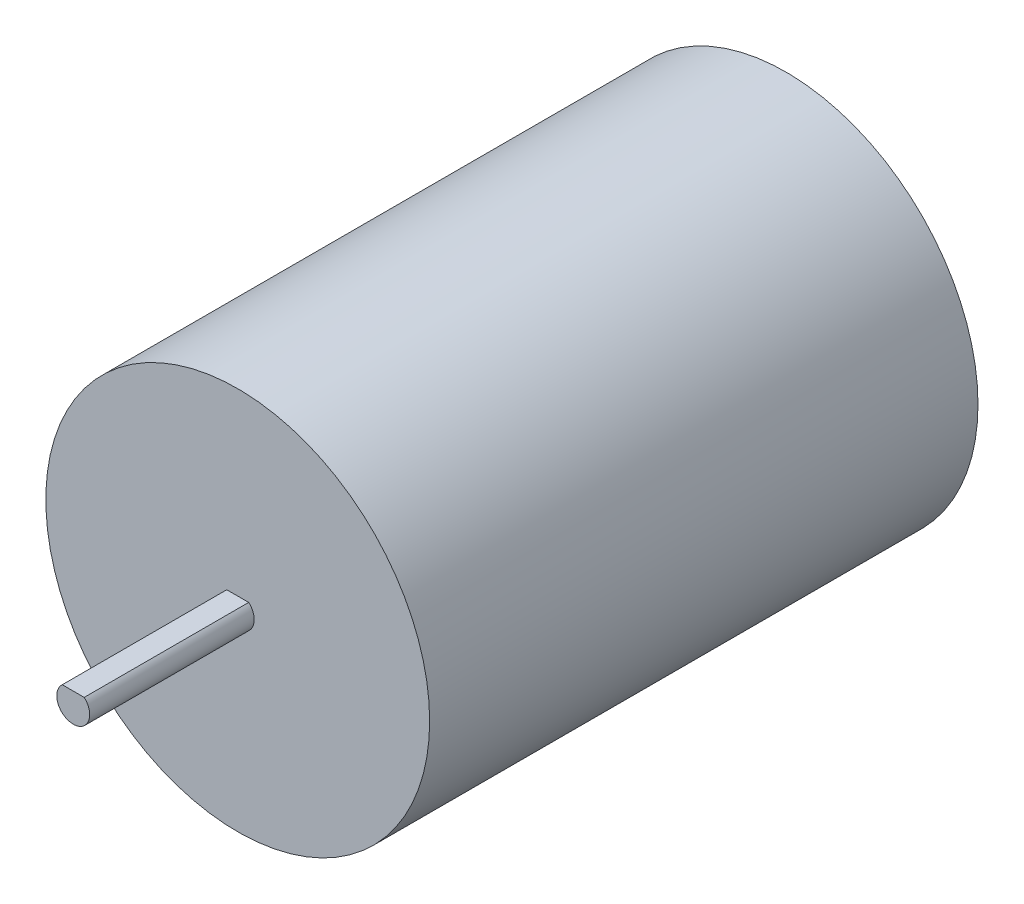
ISO-10303-21;
HEADER;
FILE_DESCRIPTION(('STEP AP214'),'2;1');
FILE_NAME('part.step','',(''),(''),'','','');
FILE_SCHEMA(('AUTOMOTIVE_DESIGN { 1 0 10303 214 1 1 1 1 }'));
ENDSEC;
DATA;
#1=APPLICATION_CONTEXT('core data for automotive mechanical design processes');
#2=APPLICATION_PROTOCOL_DEFINITION('international standard','automotive_design',2000,#1);
#3=PRODUCT_CONTEXT('',#1,'mechanical');
#4=PRODUCT('Part','Part','',(#3));
#5=PRODUCT_RELATED_PRODUCT_CATEGORY('part','',(#4));
#6=PRODUCT_DEFINITION_FORMATION('','',#4);
#7=PRODUCT_DEFINITION_CONTEXT('part definition',#1,'design');
#8=PRODUCT_DEFINITION('design','',#6,#7);
#9=PRODUCT_DEFINITION_SHAPE('','',#8);
#10=(LENGTH_UNIT() NAMED_UNIT(*) SI_UNIT(.MILLI.,.METRE.));
#11=(NAMED_UNIT(*) PLANE_ANGLE_UNIT() SI_UNIT($,.RADIAN.));
#12=(NAMED_UNIT(*) SI_UNIT($,.STERADIAN.) SOLID_ANGLE_UNIT());
#13=UNCERTAINTY_MEASURE_WITH_UNIT(LENGTH_MEASURE(1.E-05),#10,'distance_accuracy_value','');
#14=(GEOMETRIC_REPRESENTATION_CONTEXT(3) GLOBAL_UNCERTAINTY_ASSIGNED_CONTEXT((#13)) GLOBAL_UNIT_ASSIGNED_CONTEXT((#10,
#11,#12)) REPRESENTATION_CONTEXT('',''));
#15=CARTESIAN_POINT('',(0.,0.,0.));
#16=DIRECTION('',(0.,0.,1.));
#17=DIRECTION('',(1.,0.,0.));
#18=AXIS2_PLACEMENT_3D('',#15,#16,#17);
#19=CARTESIAN_POINT('',(0.,0.,50.));
#20=DIRECTION('',(0.,0.,1.));
#21=DIRECTION('',(1.,0.,0.));
#22=AXIS2_PLACEMENT_3D('',#19,#20,#21);
#23=PLANE('',#22);
#24=CARTESIAN_POINT('',(0.,0.,50.));
#25=DIRECTION('',(0.,0.,1.));
#26=DIRECTION('',(1.,0.,0.));
#27=AXIS2_PLACEMENT_3D('',#24,#25,#26);
#28=CIRCLE('',#27,17.5);
#29=CARTESIAN_POINT('',(17.5,0.,50.));
#30=VERTEX_POINT('',#29);
#31=EDGE_CURVE('E11',#30,#30,#28,.T.);
#32=ORIENTED_EDGE('',*,*,#31,.T.);
#33=EDGE_LOOP('',(#32));
#34=FACE_BOUND('',#33,.T.);
#35=DIRECTION('',(-1.,0.,0.));
#36=VECTOR('',#35,1.);
#37=CARTESIAN_POINT('',(-1.,1.11803398874989,50.));
#38=LINE('',#37,#36);
#39=CARTESIAN_POINT('',(1.,1.11803398874989,50.));
#40=VERTEX_POINT('',#39);
#41=CARTESIAN_POINT('',(-1.,1.11803398874989,50.));
#42=VERTEX_POINT('',#41);
#43=EDGE_CURVE('E62',#40,#42,#38,.T.);
#44=ORIENTED_EDGE('',*,*,#43,.F.);
#45=CARTESIAN_POINT('',(0.,0.,50.));
#46=DIRECTION('',(0.,0.,1.));
#47=DIRECTION('',(1.,0.,0.));
#48=AXIS2_PLACEMENT_3D('',#45,#46,#47);
#49=CIRCLE('',#48,1.5);
#50=EDGE_CURVE('E47',#42,#40,#49,.T.);
#51=ORIENTED_EDGE('',*,*,#50,.F.);
#52=EDGE_LOOP('',(#44,#51));
#53=FACE_BOUND('',#52,.T.);
#54=ADVANCED_FACE('F32',(#34,#53),#23,.T.);
#55=CARTESIAN_POINT('',(0.,0.,50.));
#56=DIRECTION('',(0.,0.,-1.));
#57=DIRECTION('',(-1.,0.,0.));
#58=AXIS2_PLACEMENT_3D('',#55,#56,#57);
#59=CYLINDRICAL_SURFACE('',#58,17.5);
#60=ORIENTED_EDGE('',*,*,#31,.F.);
#61=EDGE_LOOP('',(#60));
#62=FACE_BOUND('',#61,.T.);
#63=CARTESIAN_POINT('',(0.,0.,0.));
#64=DIRECTION('',(0.,0.,1.));
#65=DIRECTION('',(1.,0.,0.));
#66=AXIS2_PLACEMENT_3D('',#63,#64,#65);
#67=CIRCLE('',#66,17.5);
#68=CARTESIAN_POINT('',(17.5,0.,0.));
#69=VERTEX_POINT('',#68);
#70=EDGE_CURVE('E36',#69,#69,#67,.T.);
#71=ORIENTED_EDGE('',*,*,#70,.T.);
#72=EDGE_LOOP('',(#71));
#73=FACE_BOUND('',#72,.T.);
#74=ADVANCED_FACE('F34',(#62,#73),#59,.T.);
#75=CARTESIAN_POINT('',(0.,0.,0.));
#76=DIRECTION('',(0.,0.,1.));
#77=DIRECTION('',(1.,0.,0.));
#78=AXIS2_PLACEMENT_3D('',#75,#76,#77);
#79=PLANE('',#78);
#80=ORIENTED_EDGE('',*,*,#70,.F.);
#81=EDGE_LOOP('',(#80));
#82=FACE_BOUND('',#81,.T.);
#83=ADVANCED_FACE('F80',(#82),#79,.F.);
#84=CARTESIAN_POINT('',(0.,0.,65.));
#85=DIRECTION('',(0.,0.,-1.));
#86=DIRECTION('',(-1.,0.,0.));
#87=AXIS2_PLACEMENT_3D('',#84,#85,#86);
#88=CYLINDRICAL_SURFACE('',#87,1.5);
#89=ORIENTED_EDGE('',*,*,#50,.T.);
#90=DIRECTION('',(0.,0.,-1.));
#91=VECTOR('',#90,1.);
#92=CARTESIAN_POINT('',(1.,1.11803398874989,65.));
#93=LINE('',#92,#91);
#94=CARTESIAN_POINT('',(1.,1.11803398874989,65.));
#95=VERTEX_POINT('',#94);
#96=EDGE_CURVE('E66',#95,#40,#93,.T.);
#97=ORIENTED_EDGE('',*,*,#96,.F.);
#98=CARTESIAN_POINT('',(0.,0.,65.));
#99=DIRECTION('',(0.,0.,1.));
#100=DIRECTION('',(1.,0.,0.));
#101=AXIS2_PLACEMENT_3D('',#98,#99,#100);
#102=CIRCLE('',#101,1.5);
#103=CARTESIAN_POINT('',(-1.,1.11803398874989,65.));
#104=VERTEX_POINT('',#103);
#105=EDGE_CURVE('E68',#104,#95,#102,.T.);
#106=ORIENTED_EDGE('',*,*,#105,.F.);
#107=DIRECTION('',(0.,0.,-1.));
#108=VECTOR('',#107,1.);
#109=CARTESIAN_POINT('',(-1.,1.11803398874989,65.));
#110=LINE('',#109,#108);
#111=EDGE_CURVE('E64',#104,#42,#110,.T.);
#112=ORIENTED_EDGE('',*,*,#111,.T.);
#113=EDGE_LOOP('',(#89,#97,#106,#112));
#114=FACE_BOUND('',#113,.T.);
#115=ADVANCED_FACE('F70',(#114),#88,.T.);
#116=CARTESIAN_POINT('',(-1.,1.11803398874989,65.));
#117=DIRECTION('',(0.,-1.,0.));
#118=DIRECTION('',(0.,0.,-1.));
#119=AXIS2_PLACEMENT_3D('',#116,#117,#118);
#120=PLANE('',#119);
#121=ORIENTED_EDGE('',*,*,#43,.T.);
#122=ORIENTED_EDGE('',*,*,#111,.F.);
#123=DIRECTION('',(-1.,0.,0.));
#124=VECTOR('',#123,1.);
#125=CARTESIAN_POINT('',(-1.,1.11803398874989,65.));
#126=LINE('',#125,#124);
#127=EDGE_CURVE('E55',#95,#104,#126,.T.);
#128=ORIENTED_EDGE('',*,*,#127,.F.);
#129=ORIENTED_EDGE('',*,*,#96,.T.);
#130=EDGE_LOOP('',(#121,#122,#128,#129));
#131=FACE_BOUND('',#130,.T.);
#132=ADVANCED_FACE('F63',(#131),#120,.F.);
#133=CARTESIAN_POINT('',(0.,0.,65.));
#134=DIRECTION('',(0.,0.,1.));
#135=DIRECTION('',(1.,0.,0.));
#136=AXIS2_PLACEMENT_3D('',#133,#134,#135);
#137=PLANE('',#136);
#138=ORIENTED_EDGE('',*,*,#105,.T.);
#139=ORIENTED_EDGE('',*,*,#127,.T.);
#140=EDGE_LOOP('',(#138,#139));
#141=FACE_BOUND('',#140,.T.);
#142=ADVANCED_FACE('F96',(#141),#137,.T.);
#143=CLOSED_SHELL('',(#54,#74,#83,#115,#132,#142));
#144=MANIFOLD_SOLID_BREP('B2',#143);
#145=ADVANCED_BREP_SHAPE_REPRESENTATION('',(#18,#144),#14);
#146=SHAPE_DEFINITION_REPRESENTATION(#9,#145);
ENDSEC;
END-ISO-10303-21;
